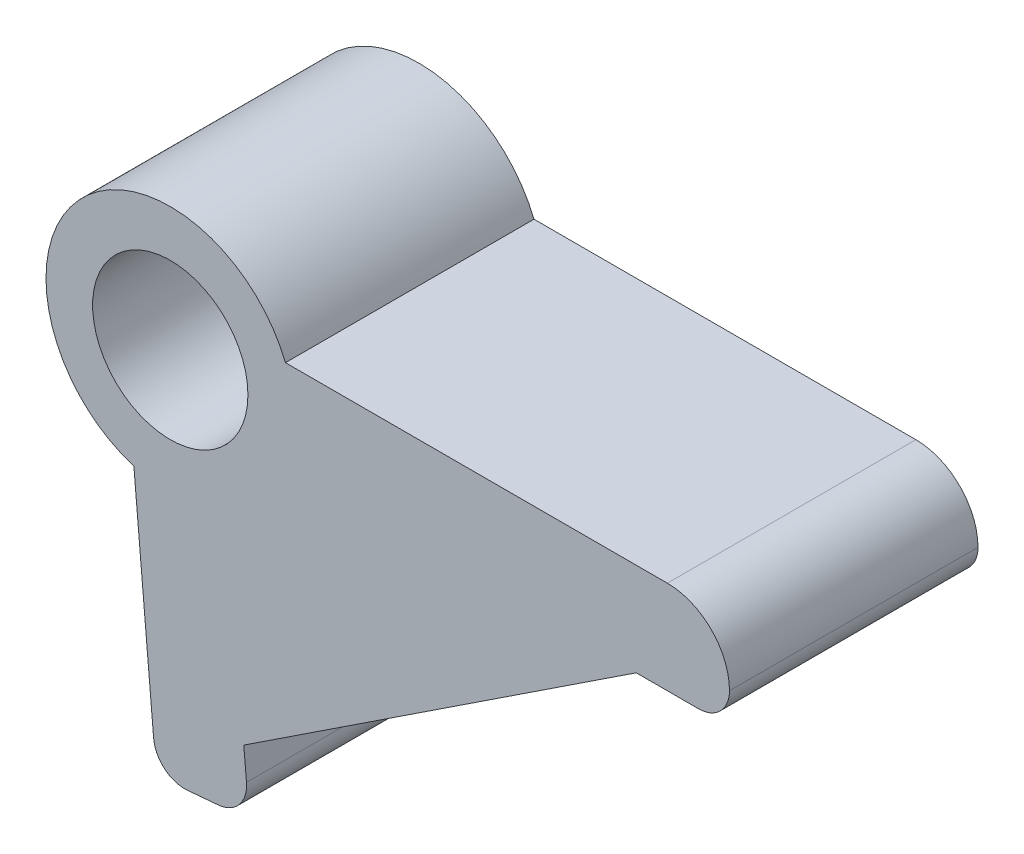
ISO-10303-21;
HEADER;
FILE_DESCRIPTION(('STEP AP214'),'2;1');
FILE_NAME('part.step','',(''),(''),'','','');
FILE_SCHEMA(('AUTOMOTIVE_DESIGN { 1 0 10303 214 1 1 1 1 }'));
ENDSEC;
DATA;
#1=APPLICATION_CONTEXT('core data for automotive mechanical design processes');
#2=APPLICATION_PROTOCOL_DEFINITION('international standard','automotive_design',2000,#1);
#3=PRODUCT_CONTEXT('',#1,'mechanical');
#4=PRODUCT('Part','Part','',(#3));
#5=PRODUCT_RELATED_PRODUCT_CATEGORY('part','',(#4));
#6=PRODUCT_DEFINITION_FORMATION('','',#4);
#7=PRODUCT_DEFINITION_CONTEXT('part definition',#1,'design');
#8=PRODUCT_DEFINITION('design','',#6,#7);
#9=PRODUCT_DEFINITION_SHAPE('','',#8);
#10=(LENGTH_UNIT() NAMED_UNIT(*) SI_UNIT(.MILLI.,.METRE.));
#11=(NAMED_UNIT(*) PLANE_ANGLE_UNIT() SI_UNIT($,.RADIAN.));
#12=(NAMED_UNIT(*) SI_UNIT($,.STERADIAN.) SOLID_ANGLE_UNIT());
#13=UNCERTAINTY_MEASURE_WITH_UNIT(LENGTH_MEASURE(1.E-05),#10,'distance_accuracy_value','');
#14=(GEOMETRIC_REPRESENTATION_CONTEXT(3) GLOBAL_UNCERTAINTY_ASSIGNED_CONTEXT((#13)) GLOBAL_UNIT_ASSIGNED_CONTEXT((#10,
#11,#12)) REPRESENTATION_CONTEXT('',''));
#15=CARTESIAN_POINT('',(0.,0.,0.));
#16=DIRECTION('',(0.,0.,1.));
#17=DIRECTION('',(1.,0.,0.));
#18=AXIS2_PLACEMENT_3D('',#15,#16,#17);
#19=CARTESIAN_POINT('',(5.23520440022578,-7.93910292673873,8.));
#20=DIRECTION('',(0.550504965163887,-0.834831889262687,0.));
#21=DIRECTION('',(0.834831889262687,0.550504965163887,0.));
#22=AXIS2_PLACEMENT_3D('',#19,#20,#21);
#23=PLANE('',#22);
#24=DIRECTION('',(-0.834831889262687,-0.550504965163887,0.));
#25=VECTOR('',#24,1.);
#26=CARTESIAN_POINT('',(5.23520440022578,-7.93910292673873,0.));
#27=LINE('',#26,#25);
#28=CARTESIAN_POINT('',(15.,-1.5,0.));
#29=VERTEX_POINT('',#28);
#30=CARTESIAN_POINT('',(2.36584947461417,-9.83121336679598,0.));
#31=VERTEX_POINT('',#30);
#32=EDGE_CURVE('E227',#29,#31,#27,.T.);
#33=ORIENTED_EDGE('',*,*,#32,.F.);
#34=DIRECTION('',(0.,0.,-1.));
#35=VECTOR('',#34,1.);
#36=CARTESIAN_POINT('',(15.,-1.5,8.));
#37=LINE('',#36,#35);
#38=CARTESIAN_POINT('',(15.,-1.5,8.));
#39=VERTEX_POINT('',#38);
#40=EDGE_CURVE('E213',#39,#29,#37,.T.);
#41=ORIENTED_EDGE('',*,*,#40,.F.);
#42=DIRECTION('',(-0.834831889262687,-0.550504965163887,0.));
#43=VECTOR('',#42,1.);
#44=CARTESIAN_POINT('',(5.23520440022578,-7.93910292673873,8.));
#45=LINE('',#44,#43);
#46=CARTESIAN_POINT('',(2.36584947461417,-9.83121336679598,8.));
#47=VERTEX_POINT('',#46);
#48=EDGE_CURVE('E219',#39,#47,#45,.T.);
#49=ORIENTED_EDGE('',*,*,#48,.T.);
#50=DIRECTION('',(0.,0.,-1.));
#51=VECTOR('',#50,1.);
#52=CARTESIAN_POINT('',(2.36584947461417,-9.83121336679598,8.));
#53=LINE('',#52,#51);
#54=EDGE_CURVE('E200',#47,#31,#53,.T.);
#55=ORIENTED_EDGE('',*,*,#54,.T.);
#56=EDGE_LOOP('',(#33,#41,#49,#55));
#57=FACE_BOUND('',#56,.T.);
#58=ADVANCED_FACE('F118',(#57),#23,.T.);
#59=CARTESIAN_POINT('',(0.,0.,0.));
#60=DIRECTION('',(0.,0.,1.));
#61=DIRECTION('',(1.,0.,0.));
#62=AXIS2_PLACEMENT_3D('',#59,#60,#61);
#63=PLANE('',#62);
#64=DIRECTION('',(1.,0.,0.));
#65=VECTOR('',#64,1.);
#66=CARTESIAN_POINT('',(3.70809924354783,1.5,0.));
#67=LINE('',#66,#65);
#68=CARTESIAN_POINT('',(3.70809924354783,1.5,0.));
#69=VERTEX_POINT('',#68);
#70=CARTESIAN_POINT('',(16.,1.5,0.));
#71=VERTEX_POINT('',#70);
#72=EDGE_CURVE('E258',#69,#71,#67,.T.);
#73=ORIENTED_EDGE('',*,*,#72,.T.);
#74=CARTESIAN_POINT('',(16.,-0.5,0.));
#75=DIRECTION('',(0.,0.,1.));
#76=DIRECTION('',(1.,0.,0.));
#77=AXIS2_PLACEMENT_3D('',#74,#75,#76);
#78=CIRCLE('',#77,2.);
#79=CARTESIAN_POINT('',(18.,-0.5,0.));
#80=VERTEX_POINT('',#79);
#81=EDGE_CURVE('E126',#71,#80,#78,.F.);
#82=ORIENTED_EDGE('',*,*,#81,.T.);
#83=CARTESIAN_POINT('',(17.,-0.5,0.));
#84=DIRECTION('',(0.,0.,1.));
#85=DIRECTION('',(1.,0.,0.));
#86=AXIS2_PLACEMENT_3D('',#83,#84,#85);
#87=CIRCLE('',#86,1.);
#88=CARTESIAN_POINT('',(17.,-1.5,0.));
#89=VERTEX_POINT('',#88);
#90=EDGE_CURVE('E272',#80,#89,#87,.F.);
#91=ORIENTED_EDGE('',*,*,#90,.T.);
#92=DIRECTION('',(1.,0.,0.));
#93=VECTOR('',#92,1.);
#94=CARTESIAN_POINT('',(3.70809924354783,-1.5,0.));
#95=LINE('',#94,#93);
#96=EDGE_CURVE('E261',#29,#89,#95,.T.);
#97=ORIENTED_EDGE('',*,*,#96,.F.);
#98=ORIENTED_EDGE('',*,*,#32,.T.);
#99=DIRECTION('',(0.0871557427476546,-0.996194698091746,0.));
#100=VECTOR('',#99,1.);
#101=CARTESIAN_POINT('',(1.81747419089105,-3.56325519229888,0.));
#102=LINE('',#101,#100);
#103=CARTESIAN_POINT('',(2.45300521736182,-10.8274080648877,0.));
#104=VERTEX_POINT('',#103);
#105=EDGE_CURVE('E207',#31,#104,#102,.T.);
#106=ORIENTED_EDGE('',*,*,#105,.T.);
#107=CARTESIAN_POINT('',(1.45681051927008,-10.9145638076354,0.));
#108=DIRECTION('',(0.,0.,1.));
#109=DIRECTION('',(1.,0.,0.));
#110=AXIS2_PLACEMENT_3D('',#107,#108,#109);
#111=CIRCLE('',#110,1.);
#112=CARTESIAN_POINT('',(1.54396626201773,-11.9107585057271,0.));
#113=VERTEX_POINT('',#112);
#114=EDGE_CURVE('E274',#104,#113,#111,.F.);
#115=ORIENTED_EDGE('',*,*,#114,.T.);
#116=DIRECTION('',(-0.996194698091746,-0.0871557427476546,0.));
#117=VECTOR('',#116,1.);
#118=CARTESIAN_POINT('',(1.04586891297186,-11.954336377101,0.));
#119=LINE('',#118,#117);
#120=CARTESIAN_POINT('',(0.547771563925984,-11.9979142484748,0.));
#121=VERTEX_POINT('',#120);
#122=EDGE_CURVE('E236',#113,#121,#119,.T.);
#123=ORIENTED_EDGE('',*,*,#122,.T.);
#124=CARTESIAN_POINT('',(0.460615821178329,-11.001719550383,0.));
#125=DIRECTION('',(0.,0.,1.));
#126=DIRECTION('',(1.,0.,0.));
#127=AXIS2_PLACEMENT_3D('',#124,#125,#126);
#128=CIRCLE('',#127,1.);
#129=CARTESIAN_POINT('',(-0.535578876913417,-11.0888752931307,0.));
#130=VERTEX_POINT('',#129);
#131=EDGE_CURVE('E276',#121,#130,#128,.F.);
#132=ORIENTED_EDGE('',*,*,#131,.T.);
#133=DIRECTION('',(-0.0871557427476546,0.996194698091746,0.));
#134=VECTOR('',#133,1.);
#135=CARTESIAN_POINT('',(-0.448423134165762,-12.0850699912224,0.));
#136=LINE('',#135,#134);
#137=CARTESIAN_POINT('',(-1.17110990338419,-3.82472242054185,0.));
#138=VERTEX_POINT('',#137);
#139=EDGE_CURVE('E253',#130,#138,#136,.T.);
#140=ORIENTED_EDGE('',*,*,#139,.T.);
#141=CARTESIAN_POINT('',(0.,0.,0.));
#142=DIRECTION('',(0.,0.,1.));
#143=DIRECTION('',(1.,0.,0.));
#144=AXIS2_PLACEMENT_3D('',#141,#142,#143);
#145=CIRCLE('',#144,4.);
#146=EDGE_CURVE('E255',#69,#138,#145,.T.);
#147=ORIENTED_EDGE('',*,*,#146,.F.);
#148=EDGE_LOOP('',(#73,#82,#91,#97,#98,#106,#115,#123,#132,#140,#147));
#149=FACE_BOUND('',#148,.T.);
#150=CARTESIAN_POINT('',(0.,0.,0.));
#151=DIRECTION('',(0.,0.,1.));
#152=DIRECTION('',(1.,0.,0.));
#153=AXIS2_PLACEMENT_3D('',#150,#151,#152);
#154=CIRCLE('',#153,2.5);
#155=CARTESIAN_POINT('',(2.5,0.,0.));
#156=VERTEX_POINT('',#155);
#157=EDGE_CURVE('E237',#156,#156,#154,.T.);
#158=ORIENTED_EDGE('',*,*,#157,.T.);
#159=EDGE_LOOP('',(#158));
#160=FACE_BOUND('',#159,.T.);
#161=ADVANCED_FACE('F294',(#149,#160),#63,.F.);
#162=CARTESIAN_POINT('',(0.,0.,8.));
#163=DIRECTION('',(0.,0.,1.));
#164=DIRECTION('',(1.,0.,0.));
#165=AXIS2_PLACEMENT_3D('',#162,#163,#164);
#166=PLANE('',#165);
#167=CARTESIAN_POINT('',(17.,-0.5,8.));
#168=DIRECTION('',(0.,0.,1.));
#169=DIRECTION('',(1.,0.,0.));
#170=AXIS2_PLACEMENT_3D('',#167,#168,#169);
#171=CIRCLE('',#170,1.);
#172=CARTESIAN_POINT('',(17.,-1.5,8.));
#173=VERTEX_POINT('',#172);
#174=CARTESIAN_POINT('',(18.,-0.5,8.));
#175=VERTEX_POINT('',#174);
#176=EDGE_CURVE('E280',#173,#175,#171,.T.);
#177=ORIENTED_EDGE('',*,*,#176,.T.);
#178=CARTESIAN_POINT('',(16.,-0.5,8.));
#179=DIRECTION('',(0.,0.,1.));
#180=DIRECTION('',(1.,0.,0.));
#181=AXIS2_PLACEMENT_3D('',#178,#179,#180);
#182=CIRCLE('',#181,2.);
#183=CARTESIAN_POINT('',(16.,1.5,8.));
#184=VERTEX_POINT('',#183);
#185=EDGE_CURVE('E12',#175,#184,#182,.T.);
#186=ORIENTED_EDGE('',*,*,#185,.T.);
#187=DIRECTION('',(1.,0.,0.));
#188=VECTOR('',#187,1.);
#189=CARTESIAN_POINT('',(3.70809924354783,1.5,8.));
#190=LINE('',#189,#188);
#191=CARTESIAN_POINT('',(3.70809924354783,1.5,8.));
#192=VERTEX_POINT('',#191);
#193=EDGE_CURVE('E248',#192,#184,#190,.T.);
#194=ORIENTED_EDGE('',*,*,#193,.F.);
#195=CARTESIAN_POINT('',(0.,0.,8.));
#196=DIRECTION('',(0.,0.,1.));
#197=DIRECTION('',(1.,0.,0.));
#198=AXIS2_PLACEMENT_3D('',#195,#196,#197);
#199=CIRCLE('',#198,4.);
#200=CARTESIAN_POINT('',(-1.17110990338419,-3.82472242054185,8.));
#201=VERTEX_POINT('',#200);
#202=EDGE_CURVE('E245',#192,#201,#199,.T.);
#203=ORIENTED_EDGE('',*,*,#202,.T.);
#204=DIRECTION('',(-0.0871557427476546,0.996194698091746,0.));
#205=VECTOR('',#204,1.);
#206=CARTESIAN_POINT('',(-0.448423134165762,-12.0850699912224,8.));
#207=LINE('',#206,#205);
#208=CARTESIAN_POINT('',(-0.535578876913417,-11.0888752931307,8.));
#209=VERTEX_POINT('',#208);
#210=EDGE_CURVE('E243',#209,#201,#207,.T.);
#211=ORIENTED_EDGE('',*,*,#210,.F.);
#212=CARTESIAN_POINT('',(0.460615821178329,-11.001719550383,8.));
#213=DIRECTION('',(0.,0.,1.));
#214=DIRECTION('',(1.,0.,0.));
#215=AXIS2_PLACEMENT_3D('',#212,#213,#214);
#216=CIRCLE('',#215,1.);
#217=CARTESIAN_POINT('',(0.547771563925983,-11.9979142484748,8.));
#218=VERTEX_POINT('',#217);
#219=EDGE_CURVE('E283',#209,#218,#216,.T.);
#220=ORIENTED_EDGE('',*,*,#219,.T.);
#221=DIRECTION('',(-0.996194698091746,-0.0871557427476548,0.));
#222=VECTOR('',#221,1.);
#223=CARTESIAN_POINT('',(2.54016096010948,-11.8236027629795,8.));
#224=LINE('',#223,#222);
#225=CARTESIAN_POINT('',(1.54396626201773,-11.9107585057271,8.));
#226=VERTEX_POINT('',#225);
#227=EDGE_CURVE('E240',#226,#218,#224,.T.);
#228=ORIENTED_EDGE('',*,*,#227,.F.);
#229=CARTESIAN_POINT('',(1.45681051927008,-10.9145638076354,8.));
#230=DIRECTION('',(0.,0.,1.));
#231=DIRECTION('',(1.,0.,0.));
#232=AXIS2_PLACEMENT_3D('',#229,#230,#231);
#233=CIRCLE('',#232,1.);
#234=CARTESIAN_POINT('',(2.45300521736182,-10.8274080648877,8.));
#235=VERTEX_POINT('',#234);
#236=EDGE_CURVE('E222',#226,#235,#233,.T.);
#237=ORIENTED_EDGE('',*,*,#236,.T.);
#238=DIRECTION('',(0.0871557427476546,-0.996194698091746,0.));
#239=VECTOR('',#238,1.);
#240=CARTESIAN_POINT('',(1.81747419089105,-3.56325519229888,8.));
#241=LINE('',#240,#239);
#242=EDGE_CURVE('E204',#47,#235,#241,.T.);
#243=ORIENTED_EDGE('',*,*,#242,.F.);
#244=ORIENTED_EDGE('',*,*,#48,.F.);
#245=DIRECTION('',(1.,0.,0.));
#246=VECTOR('',#245,1.);
#247=CARTESIAN_POINT('',(3.70809924354783,-1.5,8.));
#248=LINE('',#247,#246);
#249=EDGE_CURVE('E224',#39,#173,#248,.T.);
#250=ORIENTED_EDGE('',*,*,#249,.T.);
#251=EDGE_LOOP('',(#177,#186,#194,#203,#211,#220,#228,#237,#243,#244,#250));
#252=FACE_BOUND('',#251,.T.);
#253=CARTESIAN_POINT('',(0.,0.,8.));
#254=DIRECTION('',(0.,0.,1.));
#255=DIRECTION('',(1.,0.,0.));
#256=AXIS2_PLACEMENT_3D('',#253,#254,#255);
#257=CIRCLE('',#256,2.5);
#258=CARTESIAN_POINT('',(2.5,0.,8.));
#259=VERTEX_POINT('',#258);
#260=EDGE_CURVE('E233',#259,#259,#257,.T.);
#261=ORIENTED_EDGE('',*,*,#260,.F.);
#262=EDGE_LOOP('',(#261));
#263=FACE_BOUND('',#262,.T.);
#264=ADVANCED_FACE('F216',(#252,#263),#166,.T.);
#265=CARTESIAN_POINT('',(0.,0.,8.));
#266=DIRECTION('',(0.,0.,-1.));
#267=DIRECTION('',(-1.,0.,0.));
#268=AXIS2_PLACEMENT_3D('',#265,#266,#267);
#269=CYLINDRICAL_SURFACE('',#268,2.5);
#270=ORIENTED_EDGE('',*,*,#260,.T.);
#271=EDGE_LOOP('',(#270));
#272=FACE_BOUND('',#271,.T.);
#273=ORIENTED_EDGE('',*,*,#157,.F.);
#274=EDGE_LOOP('',(#273));
#275=FACE_BOUND('',#274,.T.);
#276=ADVANCED_FACE('F328',(#272,#275),#269,.F.);
#277=CARTESIAN_POINT('',(3.70809924354783,-1.5,8.));
#278=DIRECTION('',(0.,1.,0.));
#279=DIRECTION('',(0.,0.,1.));
#280=AXIS2_PLACEMENT_3D('',#277,#278,#279);
#281=PLANE('',#280);
#282=ORIENTED_EDGE('',*,*,#96,.T.);
#283=DIRECTION('',(0.,0.,-1.));
#284=VECTOR('',#283,1.);
#285=CARTESIAN_POINT('',(17.,-1.5,8.));
#286=LINE('',#285,#284);
#287=EDGE_CURVE('E289',#89,#173,#286,.F.);
#288=ORIENTED_EDGE('',*,*,#287,.T.);
#289=ORIENTED_EDGE('',*,*,#249,.F.);
#290=ORIENTED_EDGE('',*,*,#40,.T.);
#291=EDGE_LOOP('',(#282,#288,#289,#290));
#292=FACE_BOUND('',#291,.T.);
#293=ADVANCED_FACE('F326',(#292),#281,.F.);
#294=CARTESIAN_POINT('',(3.70809924354783,1.5,8.));
#295=DIRECTION('',(0.,1.,0.));
#296=DIRECTION('',(0.,0.,1.));
#297=AXIS2_PLACEMENT_3D('',#294,#295,#296);
#298=PLANE('',#297);
#299=ORIENTED_EDGE('',*,*,#193,.T.);
#300=DIRECTION('',(0.,0.,-1.));
#301=VECTOR('',#300,1.);
#302=CARTESIAN_POINT('',(16.,1.5,8.));
#303=LINE('',#302,#301);
#304=EDGE_CURVE('E291',#184,#71,#303,.T.);
#305=ORIENTED_EDGE('',*,*,#304,.T.);
#306=ORIENTED_EDGE('',*,*,#72,.F.);
#307=DIRECTION('',(0.,0.,-1.));
#308=VECTOR('',#307,1.);
#309=CARTESIAN_POINT('',(3.70809924354783,1.5,8.));
#310=LINE('',#309,#308);
#311=EDGE_CURVE('E230',#192,#69,#310,.T.);
#312=ORIENTED_EDGE('',*,*,#311,.F.);
#313=EDGE_LOOP('',(#299,#305,#306,#312));
#314=FACE_BOUND('',#313,.T.);
#315=ADVANCED_FACE('F305',(#314),#298,.T.);
#316=CARTESIAN_POINT('',(0.,0.,8.));
#317=DIRECTION('',(0.,0.,-1.));
#318=DIRECTION('',(-1.,0.,0.));
#319=AXIS2_PLACEMENT_3D('',#316,#317,#318);
#320=CYLINDRICAL_SURFACE('',#319,4.);
#321=ORIENTED_EDGE('',*,*,#146,.T.);
#322=DIRECTION('',(0.,0.,-1.));
#323=VECTOR('',#322,1.);
#324=CARTESIAN_POINT('',(-1.17110990338419,-3.82472242054185,8.));
#325=LINE('',#324,#323);
#326=EDGE_CURVE('E223',#201,#138,#325,.T.);
#327=ORIENTED_EDGE('',*,*,#326,.F.);
#328=ORIENTED_EDGE('',*,*,#202,.F.);
#329=ORIENTED_EDGE('',*,*,#311,.T.);
#330=EDGE_LOOP('',(#321,#327,#328,#329));
#331=FACE_BOUND('',#330,.T.);
#332=ADVANCED_FACE('F311',(#331),#320,.T.);
#333=CARTESIAN_POINT('',(-0.448423134165762,-12.0850699912224,8.));
#334=DIRECTION('',(-0.996194698091746,-0.0871557427476546,0.));
#335=DIRECTION('',(0.0871557427476546,-0.996194698091746,0.));
#336=AXIS2_PLACEMENT_3D('',#333,#334,#335);
#337=PLANE('',#336);
#338=ORIENTED_EDGE('',*,*,#139,.F.);
#339=DIRECTION('',(0.,0.,-1.));
#340=VECTOR('',#339,1.);
#341=CARTESIAN_POINT('',(-0.535578876913417,-11.0888752931307,8.));
#342=LINE('',#341,#340);
#343=EDGE_CURVE('E278',#130,#209,#342,.F.);
#344=ORIENTED_EDGE('',*,*,#343,.T.);
#345=ORIENTED_EDGE('',*,*,#210,.T.);
#346=ORIENTED_EDGE('',*,*,#326,.T.);
#347=EDGE_LOOP('',(#338,#344,#345,#346));
#348=FACE_BOUND('',#347,.T.);
#349=ADVANCED_FACE('F314',(#348),#337,.T.);
#350=CARTESIAN_POINT('',(1.04586891297186,-11.954336377101,8.));
#351=DIRECTION('',(0.0871557427476546,-0.996194698091746,0.));
#352=DIRECTION('',(0.996194698091746,0.0871557427476546,0.));
#353=AXIS2_PLACEMENT_3D('',#350,#351,#352);
#354=PLANE('',#353);
#355=ORIENTED_EDGE('',*,*,#227,.T.);
#356=DIRECTION('',(0.,0.,-1.));
#357=VECTOR('',#356,1.);
#358=CARTESIAN_POINT('',(0.547771563925983,-11.9979142484748,8.));
#359=LINE('',#358,#357);
#360=EDGE_CURVE('E269',#218,#121,#359,.T.);
#361=ORIENTED_EDGE('',*,*,#360,.T.);
#362=ORIENTED_EDGE('',*,*,#122,.F.);
#363=DIRECTION('',(0.,0.,-1.));
#364=VECTOR('',#363,1.);
#365=CARTESIAN_POINT('',(1.54396626201773,-11.9107585057271,8.));
#366=LINE('',#365,#364);
#367=EDGE_CURVE('E212',#113,#226,#366,.F.);
#368=ORIENTED_EDGE('',*,*,#367,.T.);
#369=EDGE_LOOP('',(#355,#361,#362,#368));
#370=FACE_BOUND('',#369,.T.);
#371=ADVANCED_FACE('F320',(#370),#354,.T.);
#372=CARTESIAN_POINT('',(1.81747419089105,-3.56325519229888,8.));
#373=DIRECTION('',(0.996194698091746,0.0871557427476546,0.));
#374=DIRECTION('',(-0.0871557427476546,0.996194698091746,0.));
#375=AXIS2_PLACEMENT_3D('',#372,#373,#374);
#376=PLANE('',#375);
#377=ORIENTED_EDGE('',*,*,#242,.T.);
#378=DIRECTION('',(0.,0.,-1.));
#379=VECTOR('',#378,1.);
#380=CARTESIAN_POINT('',(2.45300521736182,-10.8274080648877,8.));
#381=LINE('',#380,#379);
#382=EDGE_CURVE('E285',#235,#104,#381,.T.);
#383=ORIENTED_EDGE('',*,*,#382,.T.);
#384=ORIENTED_EDGE('',*,*,#105,.F.);
#385=ORIENTED_EDGE('',*,*,#54,.F.);
#386=EDGE_LOOP('',(#377,#383,#384,#385));
#387=FACE_BOUND('',#386,.T.);
#388=ADVANCED_FACE('F202',(#387),#376,.T.);
#389=CARTESIAN_POINT('',(0.460615821178329,-11.001719550383,8.));
#390=DIRECTION('',(0.,0.,-1.));
#391=DIRECTION('',(-1.,0.,0.));
#392=AXIS2_PLACEMENT_3D('',#389,#390,#391);
#393=CYLINDRICAL_SURFACE('',#392,1.);
#394=ORIENTED_EDGE('',*,*,#219,.F.);
#395=ORIENTED_EDGE('',*,*,#343,.F.);
#396=ORIENTED_EDGE('',*,*,#131,.F.);
#397=ORIENTED_EDGE('',*,*,#360,.F.);
#398=EDGE_LOOP('',(#394,#395,#396,#397));
#399=FACE_BOUND('',#398,.T.);
#400=ADVANCED_FACE('F317',(#399),#393,.T.);
#401=CARTESIAN_POINT('',(1.45681051927008,-10.9145638076354,8.));
#402=DIRECTION('',(0.,0.,-1.));
#403=DIRECTION('',(-1.,0.,0.));
#404=AXIS2_PLACEMENT_3D('',#401,#402,#403);
#405=CYLINDRICAL_SURFACE('',#404,1.);
#406=ORIENTED_EDGE('',*,*,#236,.F.);
#407=ORIENTED_EDGE('',*,*,#367,.F.);
#408=ORIENTED_EDGE('',*,*,#114,.F.);
#409=ORIENTED_EDGE('',*,*,#382,.F.);
#410=EDGE_LOOP('',(#406,#407,#408,#409));
#411=FACE_BOUND('',#410,.T.);
#412=ADVANCED_FACE('F324',(#411),#405,.T.);
#413=CARTESIAN_POINT('',(17.,-0.5,8.));
#414=DIRECTION('',(0.,0.,1.));
#415=DIRECTION('',(1.,0.,0.));
#416=AXIS2_PLACEMENT_3D('',#413,#414,#415);
#417=CYLINDRICAL_SURFACE('',#416,1.);
#418=ORIENTED_EDGE('',*,*,#176,.F.);
#419=ORIENTED_EDGE('',*,*,#287,.F.);
#420=ORIENTED_EDGE('',*,*,#90,.F.);
#421=DIRECTION('',(0.,0.,-1.));
#422=VECTOR('',#421,1.);
#423=CARTESIAN_POINT('',(18.,-0.5,0.));
#424=LINE('',#423,#422);
#425=EDGE_CURVE('E287',#175,#80,#424,.T.);
#426=ORIENTED_EDGE('',*,*,#425,.F.);
#427=EDGE_LOOP('',(#418,#419,#420,#426));
#428=FACE_BOUND('',#427,.T.);
#429=ADVANCED_FACE('F303',(#428),#417,.T.);
#430=CARTESIAN_POINT('',(16.,-0.5,8.));
#431=DIRECTION('',(0.,0.,-1.));
#432=DIRECTION('',(-1.,0.,0.));
#433=AXIS2_PLACEMENT_3D('',#430,#431,#432);
#434=CYLINDRICAL_SURFACE('',#433,2.);
#435=ORIENTED_EDGE('',*,*,#185,.F.);
#436=ORIENTED_EDGE('',*,*,#425,.T.);
#437=ORIENTED_EDGE('',*,*,#81,.F.);
#438=ORIENTED_EDGE('',*,*,#304,.F.);
#439=EDGE_LOOP('',(#435,#436,#437,#438));
#440=FACE_BOUND('',#439,.T.);
#441=ADVANCED_FACE('F120',(#440),#434,.T.);
#442=CLOSED_SHELL('',(#58,#161,#264,#276,#293,#315,#332,#349,#371,#388,#400,#412,#429,#441));
#443=MANIFOLD_SOLID_BREP('B2',#442);
#444=ADVANCED_BREP_SHAPE_REPRESENTATION('',(#18,#443),#14);
#445=SHAPE_DEFINITION_REPRESENTATION(#9,#444);
ENDSEC;
END-ISO-10303-21;
